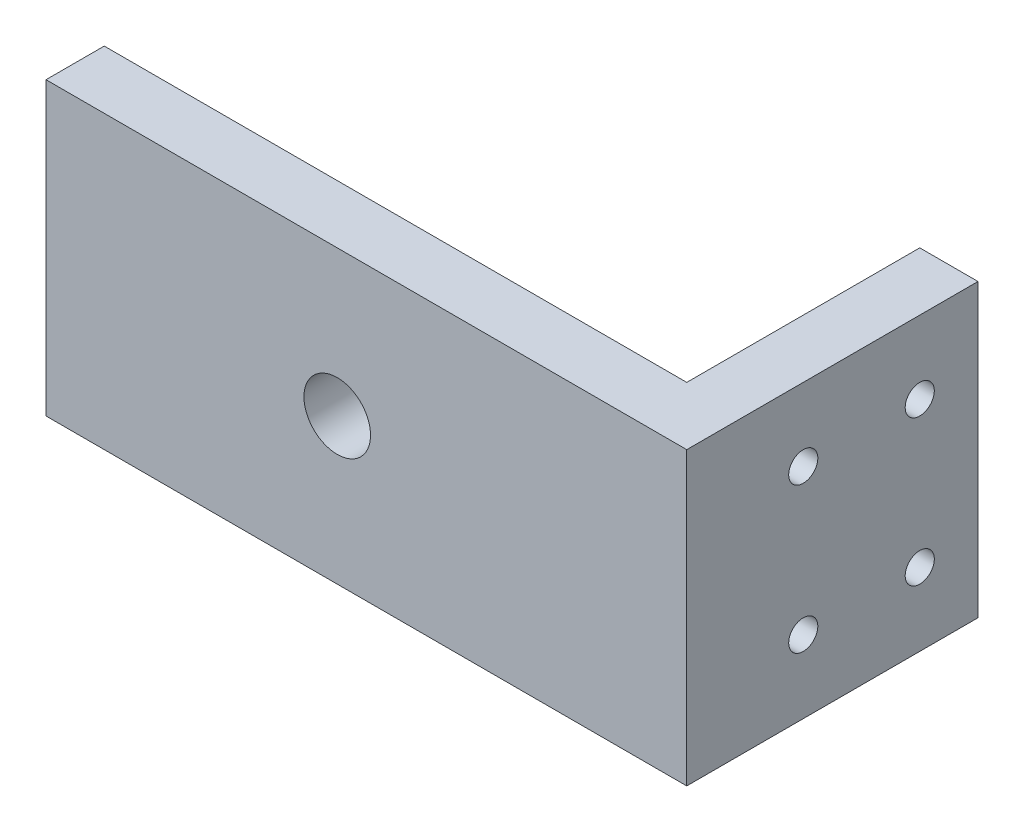
ISO-10303-21;
HEADER;
FILE_DESCRIPTION(('STEP AP214'),'2;1');
FILE_NAME('part.step','',(''),(''),'','','');
FILE_SCHEMA(('AUTOMOTIVE_DESIGN { 1 0 10303 214 1 1 1 1 }'));
ENDSEC;
DATA;
#1=APPLICATION_CONTEXT('core data for automotive mechanical design processes');
#2=APPLICATION_PROTOCOL_DEFINITION('international standard','automotive_design',2000,#1);
#3=PRODUCT_CONTEXT('',#1,'mechanical');
#4=PRODUCT('Part','Part','',(#3));
#5=PRODUCT_RELATED_PRODUCT_CATEGORY('part','',(#4));
#6=PRODUCT_DEFINITION_FORMATION('','',#4);
#7=PRODUCT_DEFINITION_CONTEXT('part definition',#1,'design');
#8=PRODUCT_DEFINITION('design','',#6,#7);
#9=PRODUCT_DEFINITION_SHAPE('','',#8);
#10=(LENGTH_UNIT() NAMED_UNIT(*) SI_UNIT(.MILLI.,.METRE.));
#11=(NAMED_UNIT(*) PLANE_ANGLE_UNIT() SI_UNIT($,.RADIAN.));
#12=(NAMED_UNIT(*) SI_UNIT($,.STERADIAN.) SOLID_ANGLE_UNIT());
#13=UNCERTAINTY_MEASURE_WITH_UNIT(LENGTH_MEASURE(1.E-05),#10,'distance_accuracy_value','');
#14=(GEOMETRIC_REPRESENTATION_CONTEXT(3) GLOBAL_UNCERTAINTY_ASSIGNED_CONTEXT((#13)) GLOBAL_UNIT_ASSIGNED_CONTEXT((#10,
#11,#12)) REPRESENTATION_CONTEXT('',''));
#15=CARTESIAN_POINT('',(0.,0.,0.));
#16=DIRECTION('',(0.,0.,1.));
#17=DIRECTION('',(1.,0.,0.));
#18=AXIS2_PLACEMENT_3D('',#15,#16,#17);
#19=CARTESIAN_POINT('',(100.,50.,-50.));
#20=DIRECTION('',(1.,0.,0.));
#21=DIRECTION('',(0.,0.,-1.));
#22=AXIS2_PLACEMENT_3D('',#19,#20,#21);
#23=PLANE('',#22);
#24=CARTESIAN_POINT('',(100.,37.5,-40.));
#25=DIRECTION('',(-1.,0.,0.));
#26=DIRECTION('',(0.,0.,1.));
#27=AXIS2_PLACEMENT_3D('',#24,#25,#26);
#28=CIRCLE('',#27,2.5);
#29=CARTESIAN_POINT('',(100.,37.5,-37.5));
#30=VERTEX_POINT('',#29);
#31=EDGE_CURVE('E194',#30,#30,#28,.T.);
#32=ORIENTED_EDGE('',*,*,#31,.F.);
#33=EDGE_LOOP('',(#32));
#34=FACE_BOUND('',#33,.T.);
#35=CARTESIAN_POINT('',(100.,37.5,-20.));
#36=DIRECTION('',(1.,0.,0.));
#37=DIRECTION('',(0.,0.,-1.));
#38=AXIS2_PLACEMENT_3D('',#35,#36,#37);
#39=CIRCLE('',#38,2.5);
#40=CARTESIAN_POINT('',(100.,37.5,-22.5));
#41=VERTEX_POINT('',#40);
#42=EDGE_CURVE('E198',#41,#41,#39,.T.);
#43=ORIENTED_EDGE('',*,*,#42,.T.);
#44=EDGE_LOOP('',(#43));
#45=FACE_BOUND('',#44,.T.);
#46=CARTESIAN_POINT('',(100.,12.5,-40.));
#47=DIRECTION('',(-1.,0.,0.));
#48=DIRECTION('',(0.,0.,1.));
#49=AXIS2_PLACEMENT_3D('',#46,#47,#48);
#50=CIRCLE('',#49,2.5);
#51=CARTESIAN_POINT('',(100.,12.5,-37.5));
#52=VERTEX_POINT('',#51);
#53=EDGE_CURVE('E201',#52,#52,#50,.F.);
#54=ORIENTED_EDGE('',*,*,#53,.T.);
#55=EDGE_LOOP('',(#54));
#56=FACE_BOUND('',#55,.T.);
#57=DIRECTION('',(0.,0.,1.));
#58=VECTOR('',#57,1.);
#59=CARTESIAN_POINT('',(100.,0.,-50.));
#60=LINE('',#59,#58);
#61=CARTESIAN_POINT('',(100.,0.,-50.));
#62=VERTEX_POINT('',#61);
#63=CARTESIAN_POINT('',(100.,0.,-10.));
#64=VERTEX_POINT('',#63);
#65=EDGE_CURVE('E135',#62,#64,#60,.T.);
#66=ORIENTED_EDGE('',*,*,#65,.T.);
#67=DIRECTION('',(0.,-1.,0.));
#68=VECTOR('',#67,1.);
#69=CARTESIAN_POINT('',(100.,50.,-10.));
#70=LINE('',#69,#68);
#71=CARTESIAN_POINT('',(100.,50.,-10.));
#72=VERTEX_POINT('',#71);
#73=EDGE_CURVE('E11',#72,#64,#70,.T.);
#74=ORIENTED_EDGE('',*,*,#73,.F.);
#75=DIRECTION('',(0.,0.,1.));
#76=VECTOR('',#75,1.);
#77=CARTESIAN_POINT('',(100.,50.,-50.));
#78=LINE('',#77,#76);
#79=CARTESIAN_POINT('',(100.,50.,-50.));
#80=VERTEX_POINT('',#79);
#81=EDGE_CURVE('E152',#80,#72,#78,.T.);
#82=ORIENTED_EDGE('',*,*,#81,.F.);
#83=DIRECTION('',(0.,-1.,0.));
#84=VECTOR('',#83,1.);
#85=CARTESIAN_POINT('',(100.,50.,-50.));
#86=LINE('',#85,#84);
#87=EDGE_CURVE('E131',#80,#62,#86,.T.);
#88=ORIENTED_EDGE('',*,*,#87,.T.);
#89=EDGE_LOOP('',(#66,#74,#82,#88));
#90=FACE_BOUND('',#89,.T.);
#91=CARTESIAN_POINT('',(100.,12.5,-20.));
#92=DIRECTION('',(-1.,0.,0.));
#93=DIRECTION('',(0.,0.,1.));
#94=AXIS2_PLACEMENT_3D('',#91,#92,#93);
#95=CIRCLE('',#94,2.5);
#96=CARTESIAN_POINT('',(100.,12.5,-17.5));
#97=VERTEX_POINT('',#96);
#98=EDGE_CURVE('E212',#97,#97,#95,.T.);
#99=ORIENTED_EDGE('',*,*,#98,.F.);
#100=EDGE_LOOP('',(#99));
#101=FACE_BOUND('',#100,.T.);
#102=ADVANCED_FACE('F45',(#34,#45,#56,#90,#101),#23,.F.);
#103=CARTESIAN_POINT('',(110.,50.,0.));
#104=DIRECTION('',(-1.,0.,0.));
#105=DIRECTION('',(0.,0.,1.));
#106=AXIS2_PLACEMENT_3D('',#103,#104,#105);
#107=PLANE('',#106);
#108=CARTESIAN_POINT('',(110.,37.5,-40.));
#109=DIRECTION('',(-1.,0.,0.));
#110=DIRECTION('',(0.,0.,1.));
#111=AXIS2_PLACEMENT_3D('',#108,#109,#110);
#112=CIRCLE('',#111,2.5);
#113=CARTESIAN_POINT('',(110.,37.5,-37.5));
#114=VERTEX_POINT('',#113);
#115=EDGE_CURVE('E255',#114,#114,#112,.F.);
#116=ORIENTED_EDGE('',*,*,#115,.F.);
#117=EDGE_LOOP('',(#116));
#118=FACE_BOUND('',#117,.T.);
#119=CARTESIAN_POINT('',(110.,37.5,-20.));
#120=DIRECTION('',(-1.,0.,0.));
#121=DIRECTION('',(0.,0.,1.));
#122=AXIS2_PLACEMENT_3D('',#119,#120,#121);
#123=CIRCLE('',#122,2.5);
#124=CARTESIAN_POINT('',(110.,37.5,-17.5));
#125=VERTEX_POINT('',#124);
#126=EDGE_CURVE('E252',#125,#125,#123,.T.);
#127=ORIENTED_EDGE('',*,*,#126,.T.);
#128=EDGE_LOOP('',(#127));
#129=FACE_BOUND('',#128,.T.);
#130=CARTESIAN_POINT('',(110.,12.5,-40.));
#131=DIRECTION('',(-1.,0.,0.));
#132=DIRECTION('',(0.,0.,1.));
#133=AXIS2_PLACEMENT_3D('',#130,#131,#132);
#134=CIRCLE('',#133,2.5);
#135=CARTESIAN_POINT('',(110.,12.5,-37.5));
#136=VERTEX_POINT('',#135);
#137=EDGE_CURVE('E205',#136,#136,#134,.T.);
#138=ORIENTED_EDGE('',*,*,#137,.T.);
#139=EDGE_LOOP('',(#138));
#140=FACE_BOUND('',#139,.T.);
#141=DIRECTION('',(0.,0.,-1.));
#142=VECTOR('',#141,1.);
#143=CARTESIAN_POINT('',(110.,0.,0.));
#144=LINE('',#143,#142);
#145=CARTESIAN_POINT('',(110.,0.,0.));
#146=VERTEX_POINT('',#145);
#147=CARTESIAN_POINT('',(110.,0.,-50.));
#148=VERTEX_POINT('',#147);
#149=EDGE_CURVE('E85',#146,#148,#144,.T.);
#150=ORIENTED_EDGE('',*,*,#149,.T.);
#151=DIRECTION('',(0.,-1.,0.));
#152=VECTOR('',#151,1.);
#153=CARTESIAN_POINT('',(110.,50.,-50.));
#154=LINE('',#153,#152);
#155=CARTESIAN_POINT('',(110.,50.,-50.));
#156=VERTEX_POINT('',#155);
#157=EDGE_CURVE('E124',#156,#148,#154,.T.);
#158=ORIENTED_EDGE('',*,*,#157,.F.);
#159=DIRECTION('',(0.,0.,-1.));
#160=VECTOR('',#159,1.);
#161=CARTESIAN_POINT('',(110.,50.,0.));
#162=LINE('',#161,#160);
#163=CARTESIAN_POINT('',(110.,50.,0.));
#164=VERTEX_POINT('',#163);
#165=EDGE_CURVE('E110',#164,#156,#162,.T.);
#166=ORIENTED_EDGE('',*,*,#165,.F.);
#167=DIRECTION('',(0.,-1.,0.));
#168=VECTOR('',#167,1.);
#169=CARTESIAN_POINT('',(110.,50.,0.));
#170=LINE('',#169,#168);
#171=EDGE_CURVE('E118',#164,#146,#170,.T.);
#172=ORIENTED_EDGE('',*,*,#171,.T.);
#173=EDGE_LOOP('',(#150,#158,#166,#172));
#174=FACE_BOUND('',#173,.T.);
#175=CARTESIAN_POINT('',(110.,12.5,-20.));
#176=DIRECTION('',(-1.,0.,0.));
#177=DIRECTION('',(0.,0.,1.));
#178=AXIS2_PLACEMENT_3D('',#175,#176,#177);
#179=CIRCLE('',#178,2.5);
#180=CARTESIAN_POINT('',(110.,12.5,-17.5));
#181=VERTEX_POINT('',#180);
#182=EDGE_CURVE('E262',#181,#181,#179,.F.);
#183=ORIENTED_EDGE('',*,*,#182,.F.);
#184=EDGE_LOOP('',(#183));
#185=FACE_BOUND('',#184,.T.);
#186=ADVANCED_FACE('F126',(#118,#129,#140,#174,#185),#107,.F.);
#187=CARTESIAN_POINT('',(100.,50.,-10.));
#188=DIRECTION('',(0.,0.,1.));
#189=DIRECTION('',(1.,0.,0.));
#190=AXIS2_PLACEMENT_3D('',#187,#188,#189);
#191=PLANE('',#190);
#192=CARTESIAN_POINT('',(50.,25.,-10.));
#193=DIRECTION('',(0.,0.,-1.));
#194=DIRECTION('',(-1.,0.,0.));
#195=AXIS2_PLACEMENT_3D('',#192,#193,#194);
#196=CIRCLE('',#195,5.71650482581228);
#197=CARTESIAN_POINT('',(44.2834951741877,25.,-10.));
#198=VERTEX_POINT('',#197);
#199=EDGE_CURVE('E204',#198,#198,#196,.T.);
#200=ORIENTED_EDGE('',*,*,#199,.F.);
#201=EDGE_LOOP('',(#200));
#202=FACE_BOUND('',#201,.T.);
#203=DIRECTION('',(-1.,0.,0.));
#204=VECTOR('',#203,1.);
#205=CARTESIAN_POINT('',(100.,0.,-10.));
#206=LINE('',#205,#204);
#207=CARTESIAN_POINT('',(0.,0.,-10.));
#208=VERTEX_POINT('',#207);
#209=EDGE_CURVE('E139',#64,#208,#206,.T.);
#210=ORIENTED_EDGE('',*,*,#209,.T.);
#211=DIRECTION('',(0.,-1.,0.));
#212=VECTOR('',#211,1.);
#213=CARTESIAN_POINT('',(0.,50.,-10.));
#214=LINE('',#213,#212);
#215=CARTESIAN_POINT('',(0.,50.,-10.));
#216=VERTEX_POINT('',#215);
#217=EDGE_CURVE('E54',#216,#208,#214,.T.);
#218=ORIENTED_EDGE('',*,*,#217,.F.);
#219=DIRECTION('',(-1.,0.,0.));
#220=VECTOR('',#219,1.);
#221=CARTESIAN_POINT('',(100.,50.,-10.));
#222=LINE('',#221,#220);
#223=EDGE_CURVE('E99',#72,#216,#222,.T.);
#224=ORIENTED_EDGE('',*,*,#223,.F.);
#225=ORIENTED_EDGE('',*,*,#73,.T.);
#226=EDGE_LOOP('',(#210,#218,#224,#225));
#227=FACE_BOUND('',#226,.T.);
#228=ADVANCED_FACE('F189',(#202,#227),#191,.F.);
#229=CARTESIAN_POINT('',(0.,50.,-10.));
#230=DIRECTION('',(1.,0.,0.));
#231=DIRECTION('',(0.,0.,-1.));
#232=AXIS2_PLACEMENT_3D('',#229,#230,#231);
#233=PLANE('',#232);
#234=DIRECTION('',(0.,0.,1.));
#235=VECTOR('',#234,1.);
#236=CARTESIAN_POINT('',(0.,0.,-10.));
#237=LINE('',#236,#235);
#238=CARTESIAN_POINT('',(0.,0.,0.));
#239=VERTEX_POINT('',#238);
#240=EDGE_CURVE('E143',#208,#239,#237,.T.);
#241=ORIENTED_EDGE('',*,*,#240,.T.);
#242=DIRECTION('',(0.,-1.,0.));
#243=VECTOR('',#242,1.);
#244=CARTESIAN_POINT('',(0.,50.,0.));
#245=LINE('',#244,#243);
#246=CARTESIAN_POINT('',(0.,50.,0.));
#247=VERTEX_POINT('',#246);
#248=EDGE_CURVE('E123',#247,#239,#245,.T.);
#249=ORIENTED_EDGE('',*,*,#248,.F.);
#250=DIRECTION('',(0.,0.,1.));
#251=VECTOR('',#250,1.);
#252=CARTESIAN_POINT('',(0.,50.,-10.));
#253=LINE('',#252,#251);
#254=EDGE_CURVE('E112',#216,#247,#253,.T.);
#255=ORIENTED_EDGE('',*,*,#254,.F.);
#256=ORIENTED_EDGE('',*,*,#217,.T.);
#257=EDGE_LOOP('',(#241,#249,#255,#256));
#258=FACE_BOUND('',#257,.T.);
#259=ADVANCED_FACE('F162',(#258),#233,.F.);
#260=CARTESIAN_POINT('',(0.,50.,0.));
#261=DIRECTION('',(0.,0.,-1.));
#262=DIRECTION('',(-1.,0.,0.));
#263=AXIS2_PLACEMENT_3D('',#260,#261,#262);
#264=PLANE('',#263);
#265=CARTESIAN_POINT('',(50.,25.,0.));
#266=DIRECTION('',(0.,0.,-1.));
#267=DIRECTION('',(-1.,0.,0.));
#268=AXIS2_PLACEMENT_3D('',#265,#266,#267);
#269=CIRCLE('',#268,5.71650482581228);
#270=CARTESIAN_POINT('',(44.2834951741877,25.,0.));
#271=VERTEX_POINT('',#270);
#272=EDGE_CURVE('E140',#271,#271,#269,.F.);
#273=ORIENTED_EDGE('',*,*,#272,.F.);
#274=EDGE_LOOP('',(#273));
#275=FACE_BOUND('',#274,.T.);
#276=DIRECTION('',(1.,0.,0.));
#277=VECTOR('',#276,1.);
#278=CARTESIAN_POINT('',(0.,0.,0.));
#279=LINE('',#278,#277);
#280=EDGE_CURVE('E121',#239,#146,#279,.T.);
#281=ORIENTED_EDGE('',*,*,#280,.T.);
#282=ORIENTED_EDGE('',*,*,#171,.F.);
#283=DIRECTION('',(1.,0.,0.));
#284=VECTOR('',#283,1.);
#285=CARTESIAN_POINT('',(0.,50.,0.));
#286=LINE('',#285,#284);
#287=EDGE_CURVE('E106',#247,#164,#286,.T.);
#288=ORIENTED_EDGE('',*,*,#287,.F.);
#289=ORIENTED_EDGE('',*,*,#248,.T.);
#290=EDGE_LOOP('',(#281,#282,#288,#289));
#291=FACE_BOUND('',#290,.T.);
#292=ADVANCED_FACE('F119',(#275,#291),#264,.F.);
#293=CARTESIAN_POINT('',(110.,50.,-50.));
#294=DIRECTION('',(0.,0.,1.));
#295=DIRECTION('',(1.,0.,0.));
#296=AXIS2_PLACEMENT_3D('',#293,#294,#295);
#297=PLANE('',#296);
#298=DIRECTION('',(-1.,0.,0.));
#299=VECTOR('',#298,1.);
#300=CARTESIAN_POINT('',(110.,0.,-50.));
#301=LINE('',#300,#299);
#302=EDGE_CURVE('E91',#148,#62,#301,.T.);
#303=ORIENTED_EDGE('',*,*,#302,.T.);
#304=ORIENTED_EDGE('',*,*,#87,.F.);
#305=DIRECTION('',(-1.,0.,0.));
#306=VECTOR('',#305,1.);
#307=CARTESIAN_POINT('',(110.,50.,-50.));
#308=LINE('',#307,#306);
#309=EDGE_CURVE('E62',#156,#80,#308,.T.);
#310=ORIENTED_EDGE('',*,*,#309,.F.);
#311=ORIENTED_EDGE('',*,*,#157,.T.);
#312=EDGE_LOOP('',(#303,#304,#310,#311));
#313=FACE_BOUND('',#312,.T.);
#314=ADVANCED_FACE('F170',(#313),#297,.F.);
#315=CARTESIAN_POINT('',(0.,50.,0.));
#316=DIRECTION('',(0.,-1.,0.));
#317=DIRECTION('',(0.,0.,-1.));
#318=AXIS2_PLACEMENT_3D('',#315,#316,#317);
#319=PLANE('',#318);
#320=ORIENTED_EDGE('',*,*,#81,.T.);
#321=ORIENTED_EDGE('',*,*,#223,.T.);
#322=ORIENTED_EDGE('',*,*,#254,.T.);
#323=ORIENTED_EDGE('',*,*,#287,.T.);
#324=ORIENTED_EDGE('',*,*,#165,.T.);
#325=ORIENTED_EDGE('',*,*,#309,.T.);
#326=EDGE_LOOP('',(#320,#321,#322,#323,#324,#325));
#327=FACE_BOUND('',#326,.T.);
#328=ADVANCED_FACE('F108',(#327),#319,.F.);
#329=CARTESIAN_POINT('',(0.,0.,0.));
#330=DIRECTION('',(0.,-1.,0.));
#331=DIRECTION('',(0.,0.,-1.));
#332=AXIS2_PLACEMENT_3D('',#329,#330,#331);
#333=PLANE('',#332);
#334=ORIENTED_EDGE('',*,*,#65,.F.);
#335=ORIENTED_EDGE('',*,*,#302,.F.);
#336=ORIENTED_EDGE('',*,*,#149,.F.);
#337=ORIENTED_EDGE('',*,*,#280,.F.);
#338=ORIENTED_EDGE('',*,*,#240,.F.);
#339=ORIENTED_EDGE('',*,*,#209,.F.);
#340=EDGE_LOOP('',(#334,#335,#336,#337,#338,#339));
#341=FACE_BOUND('',#340,.T.);
#342=ADVANCED_FACE('F165',(#341),#333,.T.);
#343=CARTESIAN_POINT('',(50.,25.,0.00100000000000794));
#344=DIRECTION('',(0.,0.,-1.));
#345=DIRECTION('',(-1.,0.,0.));
#346=AXIS2_PLACEMENT_3D('',#343,#344,#345);
#347=CYLINDRICAL_SURFACE('',#346,5.71650482581228);
#348=ORIENTED_EDGE('',*,*,#199,.T.);
#349=EDGE_LOOP('',(#348));
#350=FACE_BOUND('',#349,.T.);
#351=ORIENTED_EDGE('',*,*,#272,.T.);
#352=EDGE_LOOP('',(#351));
#353=FACE_BOUND('',#352,.T.);
#354=ADVANCED_FACE('F226',(#350,#353),#347,.F.);
#355=CARTESIAN_POINT('',(110.001,12.5,-40.));
#356=DIRECTION('',(-1.,0.,0.));
#357=DIRECTION('',(0.,0.,1.));
#358=AXIS2_PLACEMENT_3D('',#355,#356,#357);
#359=CYLINDRICAL_SURFACE('',#358,2.5);
#360=ORIENTED_EDGE('',*,*,#53,.F.);
#361=EDGE_LOOP('',(#360));
#362=FACE_BOUND('',#361,.T.);
#363=ORIENTED_EDGE('',*,*,#137,.F.);
#364=EDGE_LOOP('',(#363));
#365=FACE_BOUND('',#364,.T.);
#366=ADVANCED_FACE('F227',(#362,#365),#359,.F.);
#367=CARTESIAN_POINT('',(110.001,37.5,-20.));
#368=DIRECTION('',(-1.,0.,0.));
#369=DIRECTION('',(0.,0.,1.));
#370=AXIS2_PLACEMENT_3D('',#367,#368,#369);
#371=CYLINDRICAL_SURFACE('',#370,2.5);
#372=ORIENTED_EDGE('',*,*,#42,.F.);
#373=EDGE_LOOP('',(#372));
#374=FACE_BOUND('',#373,.T.);
#375=ORIENTED_EDGE('',*,*,#126,.F.);
#376=EDGE_LOOP('',(#375));
#377=FACE_BOUND('',#376,.T.);
#378=ADVANCED_FACE('F233',(#374,#377),#371,.F.);
#379=CARTESIAN_POINT('',(110.001,37.5,-40.));
#380=DIRECTION('',(-1.,0.,0.));
#381=DIRECTION('',(0.,0.,1.));
#382=AXIS2_PLACEMENT_3D('',#379,#380,#381);
#383=CYLINDRICAL_SURFACE('',#382,2.5);
#384=ORIENTED_EDGE('',*,*,#31,.T.);
#385=EDGE_LOOP('',(#384));
#386=FACE_BOUND('',#385,.T.);
#387=ORIENTED_EDGE('',*,*,#115,.T.);
#388=EDGE_LOOP('',(#387));
#389=FACE_BOUND('',#388,.T.);
#390=ADVANCED_FACE('F237',(#386,#389),#383,.F.);
#391=CARTESIAN_POINT('',(110.001,12.5,-20.));
#392=DIRECTION('',(-1.,0.,0.));
#393=DIRECTION('',(0.,0.,1.));
#394=AXIS2_PLACEMENT_3D('',#391,#392,#393);
#395=CYLINDRICAL_SURFACE('',#394,2.5);
#396=ORIENTED_EDGE('',*,*,#98,.T.);
#397=EDGE_LOOP('',(#396));
#398=FACE_BOUND('',#397,.T.);
#399=ORIENTED_EDGE('',*,*,#182,.T.);
#400=EDGE_LOOP('',(#399));
#401=FACE_BOUND('',#400,.T.);
#402=ADVANCED_FACE('F240',(#398,#401),#395,.F.);
#403=CLOSED_SHELL('',(#102,#186,#228,#259,#292,#314,#328,#342,#354,#366,#378,#390,#402));
#404=MANIFOLD_SOLID_BREP('B2',#403);
#405=ADVANCED_BREP_SHAPE_REPRESENTATION('',(#18,#404),#14);
#406=SHAPE_DEFINITION_REPRESENTATION(#9,#405);
ENDSEC;
END-ISO-10303-21;
